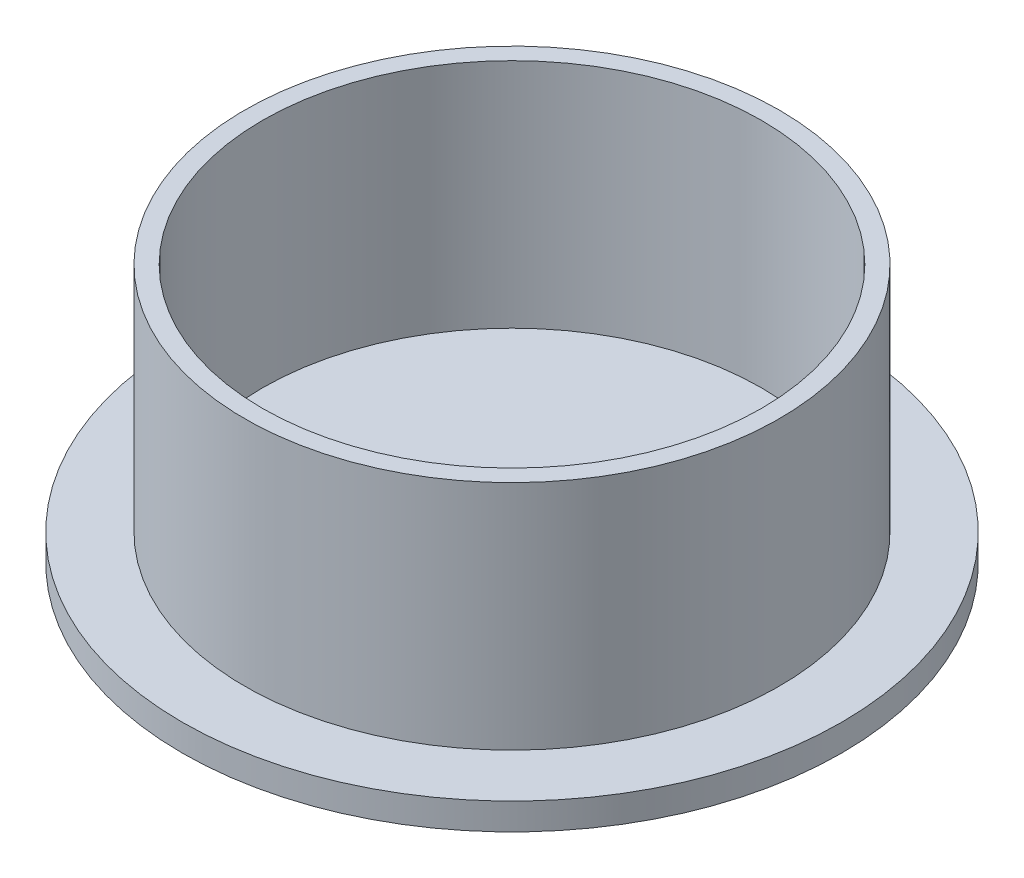
ISO-10303-21;
HEADER;
FILE_DESCRIPTION(('STEP AP214'),'2;1');
FILE_NAME('part.step','',(''),(''),'','','');
FILE_SCHEMA(('AUTOMOTIVE_DESIGN { 1 0 10303 214 1 1 1 1 }'));
ENDSEC;
DATA;
#1=APPLICATION_CONTEXT('core data for automotive mechanical design processes');
#2=APPLICATION_PROTOCOL_DEFINITION('international standard','automotive_design',2000,#1);
#3=PRODUCT_CONTEXT('',#1,'mechanical');
#4=PRODUCT('Part','Part','',(#3));
#5=PRODUCT_RELATED_PRODUCT_CATEGORY('part','',(#4));
#6=PRODUCT_DEFINITION_FORMATION('','',#4);
#7=PRODUCT_DEFINITION_CONTEXT('part definition',#1,'design');
#8=PRODUCT_DEFINITION('design','',#6,#7);
#9=PRODUCT_DEFINITION_SHAPE('','',#8);
#10=(LENGTH_UNIT() NAMED_UNIT(*) SI_UNIT(.MILLI.,.METRE.));
#11=(NAMED_UNIT(*) PLANE_ANGLE_UNIT() SI_UNIT($,.RADIAN.));
#12=(NAMED_UNIT(*) SI_UNIT($,.STERADIAN.) SOLID_ANGLE_UNIT());
#13=UNCERTAINTY_MEASURE_WITH_UNIT(LENGTH_MEASURE(1.E-05),#10,'distance_accuracy_value','');
#14=(GEOMETRIC_REPRESENTATION_CONTEXT(3) GLOBAL_UNCERTAINTY_ASSIGNED_CONTEXT((#13)) GLOBAL_UNIT_ASSIGNED_CONTEXT((#10,
#11,#12)) REPRESENTATION_CONTEXT('',''));
#15=CARTESIAN_POINT('',(0.,0.,0.));
#16=DIRECTION('',(0.,0.,1.));
#17=DIRECTION('',(1.,0.,0.));
#18=AXIS2_PLACEMENT_3D('',#15,#16,#17);
#19=CARTESIAN_POINT('',(0.,3.,0.));
#20=DIRECTION('',(0.,-1.,0.));
#21=DIRECTION('',(0.,0.,-1.));
#22=AXIS2_PLACEMENT_3D('',#19,#20,#21);
#23=CYLINDRICAL_SURFACE('',#22,37.);
#24=CARTESIAN_POINT('',(0.,3.,0.));
#25=DIRECTION('',(0.,1.,0.));
#26=DIRECTION('',(0.,0.,1.));
#27=AXIS2_PLACEMENT_3D('',#24,#25,#26);
#28=CIRCLE('',#27,37.);
#29=CARTESIAN_POINT('',(0.,3.,37.));
#30=VERTEX_POINT('',#29);
#31=EDGE_CURVE('E45',#30,#30,#28,.T.);
#32=ORIENTED_EDGE('',*,*,#31,.F.);
#33=EDGE_LOOP('',(#32));
#34=FACE_BOUND('',#33,.T.);
#35=CARTESIAN_POINT('',(0.,0.,0.));
#36=DIRECTION('',(0.,1.,0.));
#37=DIRECTION('',(0.,0.,1.));
#38=AXIS2_PLACEMENT_3D('',#35,#36,#37);
#39=CIRCLE('',#38,37.);
#40=CARTESIAN_POINT('',(0.,0.,37.));
#41=VERTEX_POINT('',#40);
#42=EDGE_CURVE('E40',#41,#41,#39,.T.);
#43=ORIENTED_EDGE('',*,*,#42,.T.);
#44=EDGE_LOOP('',(#43));
#45=FACE_BOUND('',#44,.T.);
#46=ADVANCED_FACE('F37',(#34,#45),#23,.T.);
#47=CARTESIAN_POINT('',(0.,3.,0.));
#48=DIRECTION('',(0.,1.,0.));
#49=DIRECTION('',(0.,0.,1.));
#50=AXIS2_PLACEMENT_3D('',#47,#48,#49);
#51=PLANE('',#50);
#52=CARTESIAN_POINT('',(0.,3.,0.));
#53=DIRECTION('',(0.,1.,0.));
#54=DIRECTION('',(0.,0.,1.));
#55=AXIS2_PLACEMENT_3D('',#52,#53,#54);
#56=CIRCLE('',#55,30.);
#57=CARTESIAN_POINT('',(0.,3.,-30.));
#58=VERTEX_POINT('',#57);
#59=EDGE_CURVE('E52',#58,#58,#56,.F.);
#60=ORIENTED_EDGE('',*,*,#59,.T.);
#61=EDGE_LOOP('',(#60));
#62=FACE_BOUND('',#61,.T.);
#63=ORIENTED_EDGE('',*,*,#31,.T.);
#64=EDGE_LOOP('',(#63));
#65=FACE_BOUND('',#64,.T.);
#66=ADVANCED_FACE('F123',(#62,#65),#51,.T.);
#67=CARTESIAN_POINT('',(0.,0.,0.));
#68=DIRECTION('',(0.,1.,0.));
#69=DIRECTION('',(0.,0.,1.));
#70=AXIS2_PLACEMENT_3D('',#67,#68,#69);
#71=PLANE('',#70);
#72=CARTESIAN_POINT('',(8.,0.,0.));
#73=DIRECTION('',(0.,1.,0.));
#74=DIRECTION('',(0.,0.,1.));
#75=AXIS2_PLACEMENT_3D('',#72,#73,#74);
#76=CIRCLE('',#75,2.);
#77=CARTESIAN_POINT('',(8.,0.,2.));
#78=VERTEX_POINT('',#77);
#79=EDGE_CURVE('E69',#78,#78,#76,.T.);
#80=ORIENTED_EDGE('',*,*,#79,.T.);
#81=EDGE_LOOP('',(#80));
#82=FACE_BOUND('',#81,.T.);
#83=CARTESIAN_POINT('',(0.,0.,8.));
#84=DIRECTION('',(0.,1.,0.));
#85=DIRECTION('',(0.,0.,1.));
#86=AXIS2_PLACEMENT_3D('',#83,#84,#85);
#87=CIRCLE('',#86,2.);
#88=CARTESIAN_POINT('',(0.,0.,10.));
#89=VERTEX_POINT('',#88);
#90=EDGE_CURVE('E77',#89,#89,#87,.T.);
#91=ORIENTED_EDGE('',*,*,#90,.T.);
#92=EDGE_LOOP('',(#91));
#93=FACE_BOUND('',#92,.T.);
#94=CARTESIAN_POINT('',(-8.,0.,0.));
#95=DIRECTION('',(0.,1.,0.));
#96=DIRECTION('',(0.,0.,1.));
#97=AXIS2_PLACEMENT_3D('',#94,#95,#96);
#98=CIRCLE('',#97,2.);
#99=CARTESIAN_POINT('',(-8.,0.,1.99999999999994));
#100=VERTEX_POINT('',#99);
#101=EDGE_CURVE('E78',#100,#100,#98,.T.);
#102=ORIENTED_EDGE('',*,*,#101,.T.);
#103=EDGE_LOOP('',(#102));
#104=FACE_BOUND('',#103,.T.);
#105=CARTESIAN_POINT('',(0.,0.,-8.));
#106=DIRECTION('',(0.,1.,0.));
#107=DIRECTION('',(0.,0.,1.));
#108=AXIS2_PLACEMENT_3D('',#105,#106,#107);
#109=CIRCLE('',#108,2.);
#110=CARTESIAN_POINT('',(0.,0.,-6.));
#111=VERTEX_POINT('',#110);
#112=EDGE_CURVE('E93',#111,#111,#109,.T.);
#113=ORIENTED_EDGE('',*,*,#112,.T.);
#114=EDGE_LOOP('',(#113));
#115=FACE_BOUND('',#114,.T.);
#116=CARTESIAN_POINT('',(0.,0.,0.));
#117=DIRECTION('',(0.,1.,0.));
#118=DIRECTION('',(0.,0.,1.));
#119=AXIS2_PLACEMENT_3D('',#116,#117,#118);
#120=CIRCLE('',#119,4.);
#121=CARTESIAN_POINT('',(0.,0.,4.));
#122=VERTEX_POINT('',#121);
#123=EDGE_CURVE('E64',#122,#122,#120,.T.);
#124=ORIENTED_EDGE('',*,*,#123,.T.);
#125=EDGE_LOOP('',(#124));
#126=FACE_BOUND('',#125,.T.);
#127=ORIENTED_EDGE('',*,*,#42,.F.);
#128=EDGE_LOOP('',(#127));
#129=FACE_BOUND('',#128,.T.);
#130=ADVANCED_FACE('F105',(#82,#93,#104,#115,#126,#129),#71,.F.);
#131=CARTESIAN_POINT('',(0.,29.,0.));
#132=DIRECTION('',(0.,-1.,0.));
#133=DIRECTION('',(0.,0.,-1.));
#134=AXIS2_PLACEMENT_3D('',#131,#132,#133);
#135=CYLINDRICAL_SURFACE('',#134,28.);
#136=CARTESIAN_POINT('',(0.,3.,0.));
#137=DIRECTION('',(0.,1.,0.));
#138=DIRECTION('',(0.,0.,1.));
#139=AXIS2_PLACEMENT_3D('',#136,#137,#138);
#140=CIRCLE('',#139,28.);
#141=CARTESIAN_POINT('',(0.,3.,-28.));
#142=VERTEX_POINT('',#141);
#143=EDGE_CURVE('E10',#142,#142,#140,.F.);
#144=CARTESIAN_POINT('',(0.,29.,0.));
#145=DIRECTION('',(0.,1.,0.));
#146=DIRECTION('',(0.,0.,1.));
#147=AXIS2_PLACEMENT_3D('',#144,#145,#146);
#148=CIRCLE('',#147,28.);
#149=CARTESIAN_POINT('',(0.,29.,-28.));
#150=VERTEX_POINT('',#149);
#151=EDGE_CURVE('E60',#150,#150,#148,.T.);
#152=CARTESIAN_POINT('',(0.,3.,-28.));
#153=CARTESIAN_POINT('',(0.,3.27083333333333,-28.));
#154=CARTESIAN_POINT('',(0.,3.54166666666666,-28.));
#155=CARTESIAN_POINT('',(0.,4.08333333333333,-28.));
#156=CARTESIAN_POINT('',(0.,4.35416666666666,-28.));
#157=CARTESIAN_POINT('',(0.,4.89583333333333,-28.));
#158=CARTESIAN_POINT('',(0.,5.16666666666666,-28.));
#159=CARTESIAN_POINT('',(0.,5.70833333333333,-28.));
#160=CARTESIAN_POINT('',(0.,5.97916666666667,-28.));
#161=CARTESIAN_POINT('',(0.,6.52083333333333,-28.));
#162=CARTESIAN_POINT('',(0.,6.79166666666667,-28.));
#163=CARTESIAN_POINT('',(0.,7.33333333333333,-28.));
#164=CARTESIAN_POINT('',(0.,7.60416666666666,-28.));
#165=CARTESIAN_POINT('',(0.,8.14583333333333,-28.));
#166=CARTESIAN_POINT('',(0.,8.41666666666666,-28.));
#167=CARTESIAN_POINT('',(0.,8.95833333333333,-28.));
#168=CARTESIAN_POINT('',(0.,9.22916666666666,-28.));
#169=CARTESIAN_POINT('',(0.,9.77083333333333,-28.));
#170=CARTESIAN_POINT('',(0.,10.0416666666667,-28.));
#171=CARTESIAN_POINT('',(0.,10.5833333333333,-28.));
#172=CARTESIAN_POINT('',(0.,10.8541666666667,-28.));
#173=CARTESIAN_POINT('',(0.,11.3958333333333,-28.));
#174=CARTESIAN_POINT('',(0.,11.6666666666667,-28.));
#175=CARTESIAN_POINT('',(0.,12.2083333333333,-28.));
#176=CARTESIAN_POINT('',(0.,12.4791666666667,-28.));
#177=CARTESIAN_POINT('',(0.,13.0208333333333,-28.));
#178=CARTESIAN_POINT('',(0.,13.2916666666667,-28.));
#179=CARTESIAN_POINT('',(0.,13.8333333333333,-28.));
#180=CARTESIAN_POINT('',(0.,14.1041666666667,-28.));
#181=CARTESIAN_POINT('',(0.,14.6458333333333,-28.));
#182=CARTESIAN_POINT('',(0.,14.9166666666667,-28.));
#183=CARTESIAN_POINT('',(0.,15.4583333333333,-28.));
#184=CARTESIAN_POINT('',(0.,15.7291666666667,-28.));
#185=CARTESIAN_POINT('',(0.,16.2708333333333,-28.));
#186=CARTESIAN_POINT('',(0.,16.5416666666667,-28.));
#187=CARTESIAN_POINT('',(0.,17.0833333333333,-28.));
#188=CARTESIAN_POINT('',(0.,17.3541666666667,-28.));
#189=CARTESIAN_POINT('',(0.,17.8958333333333,-28.));
#190=CARTESIAN_POINT('',(0.,18.1666666666667,-28.));
#191=CARTESIAN_POINT('',(0.,18.7083333333333,-28.));
#192=CARTESIAN_POINT('',(0.,18.9791666666667,-28.));
#193=CARTESIAN_POINT('',(0.,19.5208333333333,-28.));
#194=CARTESIAN_POINT('',(0.,19.7916666666667,-28.));
#195=CARTESIAN_POINT('',(0.,20.3333333333333,-28.));
#196=CARTESIAN_POINT('',(0.,20.6041666666667,-28.));
#197=CARTESIAN_POINT('',(0.,21.1458333333333,-28.));
#198=CARTESIAN_POINT('',(0.,21.4166666666667,-28.));
#199=CARTESIAN_POINT('',(0.,21.9583333333333,-28.));
#200=CARTESIAN_POINT('',(0.,22.2291666666667,-28.));
#201=CARTESIAN_POINT('',(0.,22.7708333333333,-28.));
#202=CARTESIAN_POINT('',(0.,23.0416666666667,-28.));
#203=CARTESIAN_POINT('',(0.,23.5833333333333,-28.));
#204=CARTESIAN_POINT('',(0.,23.8541666666667,-28.));
#205=CARTESIAN_POINT('',(0.,24.3958333333333,-28.));
#206=CARTESIAN_POINT('',(0.,24.6666666666667,-28.));
#207=CARTESIAN_POINT('',(0.,25.2083333333333,-28.));
#208=CARTESIAN_POINT('',(0.,25.4791666666667,-28.));
#209=CARTESIAN_POINT('',(0.,26.0208333333333,-28.));
#210=CARTESIAN_POINT('',(0.,26.2916666666667,-28.));
#211=CARTESIAN_POINT('',(0.,26.8333333333333,-28.));
#212=CARTESIAN_POINT('',(0.,27.1041666666667,-28.));
#213=CARTESIAN_POINT('',(0.,27.6458333333333,-28.));
#214=CARTESIAN_POINT('',(0.,27.9166666666667,-28.));
#215=CARTESIAN_POINT('',(0.,28.4583333333333,-28.));
#216=CARTESIAN_POINT('',(0.,28.7291666666667,-28.));
#217=CARTESIAN_POINT('',(0.,29.,-28.));
#218=B_SPLINE_CURVE_WITH_KNOTS('',3,(#152,#153,#154,#155,#156,#157,#158,#159,#160,#161,#162,
#163,#164,#165,#166,#167,#168,#169,#170,#171,#172,#173,#174,#175,#176,#177,#178,#179,#180,#181,
#182,#183,#184,#185,#186,#187,#188,#189,#190,#191,#192,#193,#194,#195,#196,#197,#198,#199,#200,
#201,#202,#203,#204,#205,#206,#207,#208,#209,#210,#211,#212,#213,#214,#215,#216,#217),
.UNSPECIFIED.,.F.,.F.,(4,2,2,2,2,2,2,2,2,2,2,2,2,2,2,2,2,2,2,2,2,2,2,2,2,2,2,2,2,2,2,2,4),(0.,
0.812500000000001,1.625,2.4375,3.25,4.0625,4.875,5.6875,6.5,7.3125,8.125,8.9375,9.75,10.5625,
11.375,12.1875,13.,13.8125,14.625,15.4375,16.25,17.0625,17.875,18.6875,19.5,20.3125,21.125,
21.9375,22.75,23.5625,24.375,25.1875,26.),.UNSPECIFIED.);
#219=EDGE_CURVE('BSEAM153',#142,#150,#218,.T.);
#220=ORIENTED_EDGE('',*,*,#143,.T.);
#221=ORIENTED_EDGE('',*,*,#151,.T.);
#222=ORIENTED_EDGE('',*,*,#219,.T.);
#223=ORIENTED_EDGE('',*,*,#219,.F.);
#224=EDGE_LOOP('',(#220,#222,#221,#223));
#225=FACE_BOUND('',#224,.T.);
#226=ADVANCED_FACE('F153',(#225),#135,.F.);
#227=CARTESIAN_POINT('',(0.,29.,0.));
#228=DIRECTION('',(0.,-1.,0.));
#229=DIRECTION('',(0.,0.,-1.));
#230=AXIS2_PLACEMENT_3D('',#227,#228,#229);
#231=CYLINDRICAL_SURFACE('',#230,30.);
#232=CARTESIAN_POINT('',(0.,29.,0.));
#233=DIRECTION('',(0.,1.,0.));
#234=DIRECTION('',(0.,0.,1.));
#235=AXIS2_PLACEMENT_3D('',#232,#233,#234);
#236=CIRCLE('',#235,30.);
#237=CARTESIAN_POINT('',(0.,29.,-30.));
#238=VERTEX_POINT('',#237);
#239=EDGE_CURVE('E56',#238,#238,#236,.T.);
#240=CARTESIAN_POINT('',(0.,3.,-30.));
#241=CARTESIAN_POINT('',(0.,3.27083333333333,-30.));
#242=CARTESIAN_POINT('',(0.,3.54166666666666,-30.));
#243=CARTESIAN_POINT('',(0.,4.08333333333333,-30.));
#244=CARTESIAN_POINT('',(0.,4.35416666666666,-30.));
#245=CARTESIAN_POINT('',(0.,4.89583333333333,-30.));
#246=CARTESIAN_POINT('',(0.,5.16666666666666,-30.));
#247=CARTESIAN_POINT('',(0.,5.70833333333333,-30.));
#248=CARTESIAN_POINT('',(0.,5.97916666666667,-30.));
#249=CARTESIAN_POINT('',(0.,6.52083333333333,-30.));
#250=CARTESIAN_POINT('',(0.,6.79166666666667,-30.));
#251=CARTESIAN_POINT('',(0.,7.33333333333333,-30.));
#252=CARTESIAN_POINT('',(0.,7.60416666666666,-30.));
#253=CARTESIAN_POINT('',(0.,8.14583333333333,-30.));
#254=CARTESIAN_POINT('',(0.,8.41666666666666,-30.));
#255=CARTESIAN_POINT('',(0.,8.95833333333333,-30.));
#256=CARTESIAN_POINT('',(0.,9.22916666666666,-30.));
#257=CARTESIAN_POINT('',(0.,9.77083333333333,-30.));
#258=CARTESIAN_POINT('',(0.,10.0416666666667,-30.));
#259=CARTESIAN_POINT('',(0.,10.5833333333333,-30.));
#260=CARTESIAN_POINT('',(0.,10.8541666666667,-30.));
#261=CARTESIAN_POINT('',(0.,11.3958333333333,-30.));
#262=CARTESIAN_POINT('',(0.,11.6666666666667,-30.));
#263=CARTESIAN_POINT('',(0.,12.2083333333333,-30.));
#264=CARTESIAN_POINT('',(0.,12.4791666666667,-30.));
#265=CARTESIAN_POINT('',(0.,13.0208333333333,-30.));
#266=CARTESIAN_POINT('',(0.,13.2916666666667,-30.));
#267=CARTESIAN_POINT('',(0.,13.8333333333333,-30.));
#268=CARTESIAN_POINT('',(0.,14.1041666666667,-30.));
#269=CARTESIAN_POINT('',(0.,14.6458333333333,-30.));
#270=CARTESIAN_POINT('',(0.,14.9166666666667,-30.));
#271=CARTESIAN_POINT('',(0.,15.4583333333333,-30.));
#272=CARTESIAN_POINT('',(0.,15.7291666666667,-30.));
#273=CARTESIAN_POINT('',(0.,16.2708333333333,-30.));
#274=CARTESIAN_POINT('',(0.,16.5416666666667,-30.));
#275=CARTESIAN_POINT('',(0.,17.0833333333333,-30.));
#276=CARTESIAN_POINT('',(0.,17.3541666666667,-30.));
#277=CARTESIAN_POINT('',(0.,17.8958333333333,-30.));
#278=CARTESIAN_POINT('',(0.,18.1666666666667,-30.));
#279=CARTESIAN_POINT('',(0.,18.7083333333333,-30.));
#280=CARTESIAN_POINT('',(0.,18.9791666666667,-30.));
#281=CARTESIAN_POINT('',(0.,19.5208333333333,-30.));
#282=CARTESIAN_POINT('',(0.,19.7916666666667,-30.));
#283=CARTESIAN_POINT('',(0.,20.3333333333333,-30.));
#284=CARTESIAN_POINT('',(0.,20.6041666666667,-30.));
#285=CARTESIAN_POINT('',(0.,21.1458333333333,-30.));
#286=CARTESIAN_POINT('',(0.,21.4166666666667,-30.));
#287=CARTESIAN_POINT('',(0.,21.9583333333333,-30.));
#288=CARTESIAN_POINT('',(0.,22.2291666666667,-30.));
#289=CARTESIAN_POINT('',(0.,22.7708333333333,-30.));
#290=CARTESIAN_POINT('',(0.,23.0416666666667,-30.));
#291=CARTESIAN_POINT('',(0.,23.5833333333333,-30.));
#292=CARTESIAN_POINT('',(0.,23.8541666666667,-30.));
#293=CARTESIAN_POINT('',(0.,24.3958333333333,-30.));
#294=CARTESIAN_POINT('',(0.,24.6666666666667,-30.));
#295=CARTESIAN_POINT('',(0.,25.2083333333333,-30.));
#296=CARTESIAN_POINT('',(0.,25.4791666666667,-30.));
#297=CARTESIAN_POINT('',(0.,26.0208333333333,-30.));
#298=CARTESIAN_POINT('',(0.,26.2916666666667,-30.));
#299=CARTESIAN_POINT('',(0.,26.8333333333333,-30.));
#300=CARTESIAN_POINT('',(0.,27.1041666666667,-30.));
#301=CARTESIAN_POINT('',(0.,27.6458333333333,-30.));
#302=CARTESIAN_POINT('',(0.,27.9166666666667,-30.));
#303=CARTESIAN_POINT('',(0.,28.4583333333333,-30.));
#304=CARTESIAN_POINT('',(0.,28.7291666666667,-30.));
#305=CARTESIAN_POINT('',(0.,29.,-30.));
#306=B_SPLINE_CURVE_WITH_KNOTS('',3,(#240,#241,#242,#243,#244,#245,#246,#247,#248,#249,#250,
#251,#252,#253,#254,#255,#256,#257,#258,#259,#260,#261,#262,#263,#264,#265,#266,#267,#268,#269,
#270,#271,#272,#273,#274,#275,#276,#277,#278,#279,#280,#281,#282,#283,#284,#285,#286,#287,#288,
#289,#290,#291,#292,#293,#294,#295,#296,#297,#298,#299,#300,#301,#302,#303,#304,#305),
.UNSPECIFIED.,.F.,.F.,(4,2,2,2,2,2,2,2,2,2,2,2,2,2,2,2,2,2,2,2,2,2,2,2,2,2,2,2,2,2,2,2,4),(0.,
0.812500000000001,1.625,2.4375,3.25,4.0625,4.875,5.6875,6.5,7.3125,8.125,8.9375,9.75,10.5625,
11.375,12.1875,13.,13.8125,14.625,15.4375,16.25,17.0625,17.875,18.6875,19.5,20.3125,21.125,
21.9375,22.75,23.5625,24.375,25.1875,26.),.UNSPECIFIED.);
#307=EDGE_CURVE('BSEAM158',#58,#238,#306,.T.);
#308=ORIENTED_EDGE('',*,*,#59,.F.);
#309=ORIENTED_EDGE('',*,*,#239,.F.);
#310=ORIENTED_EDGE('',*,*,#307,.T.);
#311=ORIENTED_EDGE('',*,*,#307,.F.);
#312=EDGE_LOOP('',(#308,#310,#309,#311));
#313=FACE_BOUND('',#312,.T.);
#314=ADVANCED_FACE('F158',(#313),#231,.T.);
#315=CARTESIAN_POINT('',(0.,29.,0.));
#316=DIRECTION('',(0.,1.,0.));
#317=DIRECTION('',(0.,0.,1.));
#318=AXIS2_PLACEMENT_3D('',#315,#316,#317);
#319=PLANE('',#318);
#320=ORIENTED_EDGE('',*,*,#151,.F.);
#321=EDGE_LOOP('',(#320));
#322=FACE_BOUND('',#321,.T.);
#323=ORIENTED_EDGE('',*,*,#239,.T.);
#324=EDGE_LOOP('',(#323));
#325=FACE_BOUND('',#324,.T.);
#326=ADVANCED_FACE('F120',(#322,#325),#319,.T.);
#327=CARTESIAN_POINT('',(8.,3.,0.));
#328=DIRECTION('',(0.,1.,0.));
#329=DIRECTION('',(0.,0.,1.));
#330=AXIS2_PLACEMENT_3D('',#327,#328,#329);
#331=CIRCLE('',#330,2.);
#332=CARTESIAN_POINT('',(8.,3.,2.));
#333=VERTEX_POINT('',#332);
#334=EDGE_CURVE('E82',#333,#333,#331,.T.);
#335=ORIENTED_EDGE('',*,*,#334,.F.);
#336=EDGE_LOOP('',(#335));
#337=FACE_BOUND('',#336,.T.);
#338=CARTESIAN_POINT('',(0.,3.,8.));
#339=DIRECTION('',(0.,1.,0.));
#340=DIRECTION('',(0.,0.,1.));
#341=AXIS2_PLACEMENT_3D('',#338,#339,#340);
#342=CIRCLE('',#341,2.);
#343=CARTESIAN_POINT('',(0.,3.,10.));
#344=VERTEX_POINT('',#343);
#345=EDGE_CURVE('E73',#344,#344,#342,.T.);
#346=ORIENTED_EDGE('',*,*,#345,.F.);
#347=EDGE_LOOP('',(#346));
#348=FACE_BOUND('',#347,.T.);
#349=CARTESIAN_POINT('',(-8.,3.,0.));
#350=DIRECTION('',(0.,1.,0.));
#351=DIRECTION('',(0.,0.,1.));
#352=AXIS2_PLACEMENT_3D('',#349,#350,#351);
#353=CIRCLE('',#352,2.);
#354=CARTESIAN_POINT('',(-8.,3.,1.99999999999994));
#355=VERTEX_POINT('',#354);
#356=EDGE_CURVE('E97',#355,#355,#353,.T.);
#357=ORIENTED_EDGE('',*,*,#356,.F.);
#358=EDGE_LOOP('',(#357));
#359=FACE_BOUND('',#358,.T.);
#360=CARTESIAN_POINT('',(0.,3.,-8.));
#361=DIRECTION('',(0.,1.,0.));
#362=DIRECTION('',(0.,0.,1.));
#363=AXIS2_PLACEMENT_3D('',#360,#361,#362);
#364=CIRCLE('',#363,2.);
#365=CARTESIAN_POINT('',(0.,3.,-6.));
#366=VERTEX_POINT('',#365);
#367=EDGE_CURVE('E89',#366,#366,#364,.T.);
#368=ORIENTED_EDGE('',*,*,#367,.F.);
#369=EDGE_LOOP('',(#368));
#370=FACE_BOUND('',#369,.T.);
#371=CARTESIAN_POINT('',(0.,3.,0.));
#372=DIRECTION('',(0.,1.,0.));
#373=DIRECTION('',(0.,0.,1.));
#374=AXIS2_PLACEMENT_3D('',#371,#372,#373);
#375=CIRCLE('',#374,4.);
#376=CARTESIAN_POINT('',(0.,3.,4.));
#377=VERTEX_POINT('',#376);
#378=EDGE_CURVE('E65',#377,#377,#375,.T.);
#379=ORIENTED_EDGE('',*,*,#378,.F.);
#380=EDGE_LOOP('',(#379));
#381=FACE_BOUND('',#380,.T.);
#382=ORIENTED_EDGE('',*,*,#143,.F.);
#383=EDGE_LOOP('',(#382));
#384=FACE_BOUND('',#383,.T.);
#385=ADVANCED_FACE('F116',(#337,#348,#359,#370,#381,#384),#51,.T.);
#386=CARTESIAN_POINT('',(0.,0.,0.));
#387=DIRECTION('',(0.,1.,0.));
#388=DIRECTION('',(0.,0.,1.));
#389=AXIS2_PLACEMENT_3D('',#386,#387,#388);
#390=CYLINDRICAL_SURFACE('',#389,4.);
#391=ORIENTED_EDGE('',*,*,#123,.F.);
#392=EDGE_LOOP('',(#391));
#393=FACE_BOUND('',#392,.T.);
#394=ORIENTED_EDGE('',*,*,#378,.T.);
#395=EDGE_LOOP('',(#394));
#396=FACE_BOUND('',#395,.T.);
#397=ADVANCED_FACE('F119',(#393,#396),#390,.F.);
#398=CARTESIAN_POINT('',(0.,0.,-8.));
#399=DIRECTION('',(0.,1.,0.));
#400=DIRECTION('',(0.,0.,1.));
#401=AXIS2_PLACEMENT_3D('',#398,#399,#400);
#402=CYLINDRICAL_SURFACE('',#401,2.);
#403=ORIENTED_EDGE('',*,*,#112,.F.);
#404=EDGE_LOOP('',(#403));
#405=FACE_BOUND('',#404,.T.);
#406=ORIENTED_EDGE('',*,*,#367,.T.);
#407=EDGE_LOOP('',(#406));
#408=FACE_BOUND('',#407,.T.);
#409=ADVANCED_FACE('F112',(#405,#408),#402,.F.);
#410=CARTESIAN_POINT('',(-8.,0.,0.));
#411=DIRECTION('',(0.,1.,0.));
#412=DIRECTION('',(0.,0.,1.));
#413=AXIS2_PLACEMENT_3D('',#410,#411,#412);
#414=CYLINDRICAL_SURFACE('',#413,2.);
#415=ORIENTED_EDGE('',*,*,#101,.F.);
#416=EDGE_LOOP('',(#415));
#417=FACE_BOUND('',#416,.T.);
#418=ORIENTED_EDGE('',*,*,#356,.T.);
#419=EDGE_LOOP('',(#418));
#420=FACE_BOUND('',#419,.T.);
#421=ADVANCED_FACE('F108',(#417,#420),#414,.F.);
#422=CARTESIAN_POINT('',(0.,0.,8.));
#423=DIRECTION('',(0.,1.,0.));
#424=DIRECTION('',(0.,0.,1.));
#425=AXIS2_PLACEMENT_3D('',#422,#423,#424);
#426=CYLINDRICAL_SURFACE('',#425,2.);
#427=ORIENTED_EDGE('',*,*,#90,.F.);
#428=EDGE_LOOP('',(#427));
#429=FACE_BOUND('',#428,.T.);
#430=ORIENTED_EDGE('',*,*,#345,.T.);
#431=EDGE_LOOP('',(#430));
#432=FACE_BOUND('',#431,.T.);
#433=ADVANCED_FACE('F111',(#429,#432),#426,.F.);
#434=CARTESIAN_POINT('',(8.,0.,0.));
#435=DIRECTION('',(0.,1.,0.));
#436=DIRECTION('',(0.,0.,1.));
#437=AXIS2_PLACEMENT_3D('',#434,#435,#436);
#438=CYLINDRICAL_SURFACE('',#437,2.);
#439=ORIENTED_EDGE('',*,*,#79,.F.);
#440=EDGE_LOOP('',(#439));
#441=FACE_BOUND('',#440,.T.);
#442=ORIENTED_EDGE('',*,*,#334,.T.);
#443=EDGE_LOOP('',(#442));
#444=FACE_BOUND('',#443,.T.);
#445=ADVANCED_FACE('F207',(#441,#444),#438,.F.);
#446=CLOSED_SHELL('',(#46,#66,#130,#226,#314,#326,#385,#397,#409,#421,#433,#445));
#447=MANIFOLD_SOLID_BREP('B2',#446);
#448=ADVANCED_BREP_SHAPE_REPRESENTATION('',(#18,#447),#14);
#449=SHAPE_DEFINITION_REPRESENTATION(#9,#448);
ENDSEC;
END-ISO-10303-21;
